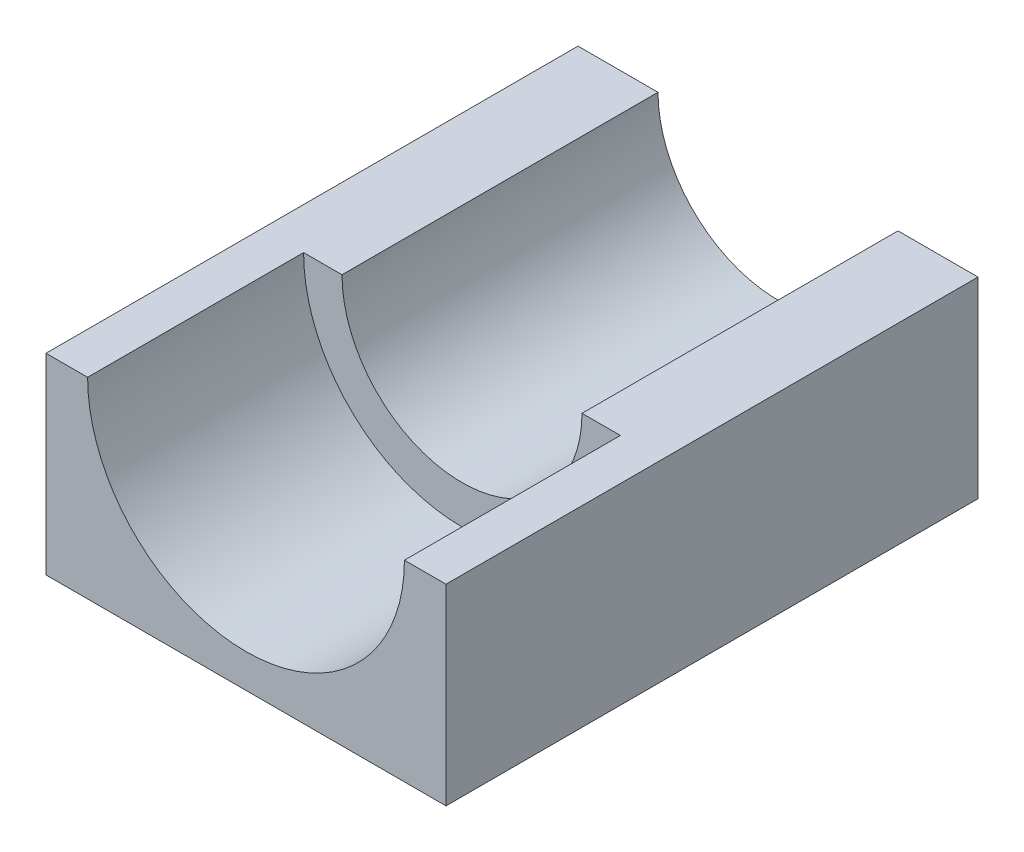
ISO-10303-21;
HEADER;
FILE_DESCRIPTION(('STEP AP214'),'2;1');
FILE_NAME('part.step','',(''),(''),'','','');
FILE_SCHEMA(('AUTOMOTIVE_DESIGN { 1 0 10303 214 1 1 1 1 }'));
ENDSEC;
DATA;
#1=APPLICATION_CONTEXT('core data for automotive mechanical design processes');
#2=APPLICATION_PROTOCOL_DEFINITION('international standard','automotive_design',2000,#1);
#3=PRODUCT_CONTEXT('',#1,'mechanical');
#4=PRODUCT('Part','Part','',(#3));
#5=PRODUCT_RELATED_PRODUCT_CATEGORY('part','',(#4));
#6=PRODUCT_DEFINITION_FORMATION('','',#4);
#7=PRODUCT_DEFINITION_CONTEXT('part definition',#1,'design');
#8=PRODUCT_DEFINITION('design','',#6,#7);
#9=PRODUCT_DEFINITION_SHAPE('','',#8);
#10=(LENGTH_UNIT() NAMED_UNIT(*) SI_UNIT(.MILLI.,.METRE.));
#11=(NAMED_UNIT(*) PLANE_ANGLE_UNIT() SI_UNIT($,.RADIAN.));
#12=(NAMED_UNIT(*) SI_UNIT($,.STERADIAN.) SOLID_ANGLE_UNIT());
#13=UNCERTAINTY_MEASURE_WITH_UNIT(LENGTH_MEASURE(1.E-05),#10,'distance_accuracy_value','');
#14=(GEOMETRIC_REPRESENTATION_CONTEXT(3) GLOBAL_UNCERTAINTY_ASSIGNED_CONTEXT((#13)) GLOBAL_UNIT_ASSIGNED_CONTEXT((#10,
#11,#12)) REPRESENTATION_CONTEXT('',''));
#15=CARTESIAN_POINT('',(0.,0.,0.));
#16=DIRECTION('',(0.,0.,1.));
#17=DIRECTION('',(1.,0.,0.));
#18=AXIS2_PLACEMENT_3D('',#15,#16,#17);
#19=CARTESIAN_POINT('',(-20.5820227256488,8.15048099935691,-66.5));
#20=DIRECTION('',(0.,1.,0.));
#21=DIRECTION('',(0.,0.,1.));
#22=AXIS2_PLACEMENT_3D('',#19,#20,#21);
#23=PLANE('',#22);
#24=DIRECTION('',(0.,0.,1.));
#25=VECTOR('',#24,1.);
#26=CARTESIAN_POINT('',(-10.5820227256488,8.15048099935691,-66.5));
#27=LINE('',#26,#25);
#28=CARTESIAN_POINT('',(-10.5820227256488,8.15048099935691,-66.5));
#29=VERTEX_POINT('',#28);
#30=CARTESIAN_POINT('',(-10.5820227256488,8.15048099935691,-27.));
#31=VERTEX_POINT('',#30);
#32=EDGE_CURVE('E46',#29,#31,#27,.T.);
#33=ORIENTED_EDGE('',*,*,#32,.F.);
#34=DIRECTION('',(-1.,0.,0.));
#35=VECTOR('',#34,1.);
#36=CARTESIAN_POINT('',(-20.5820227256488,8.15048099935691,-66.5));
#37=LINE('',#36,#35);
#38=CARTESIAN_POINT('',(-20.5820227256488,8.15048099935691,-66.5));
#39=VERTEX_POINT('',#38);
#40=EDGE_CURVE('E110',#29,#39,#37,.T.);
#41=ORIENTED_EDGE('',*,*,#40,.T.);
#42=DIRECTION('',(0.,0.,1.));
#43=VECTOR('',#42,1.);
#44=CARTESIAN_POINT('',(-20.5820227256488,8.15048099935691,-66.5));
#45=LINE('',#44,#43);
#46=CARTESIAN_POINT('',(-20.5820227256488,8.15048099935691,0.));
#47=VERTEX_POINT('',#46);
#48=EDGE_CURVE('E142',#39,#47,#45,.T.);
#49=ORIENTED_EDGE('',*,*,#48,.T.);
#50=DIRECTION('',(-1.,0.,0.));
#51=VECTOR('',#50,1.);
#52=CARTESIAN_POINT('',(-20.5820227256488,8.15048099935691,0.));
#53=LINE('',#52,#51);
#54=CARTESIAN_POINT('',(-15.3820227256488,8.15048099935691,0.));
#55=VERTEX_POINT('',#54);
#56=EDGE_CURVE('E129',#55,#47,#53,.T.);
#57=ORIENTED_EDGE('',*,*,#56,.F.);
#58=DIRECTION('',(0.,0.,1.));
#59=VECTOR('',#58,1.);
#60=CARTESIAN_POINT('',(-15.3820227256488,8.15048099935691,-27.));
#61=LINE('',#60,#59);
#62=CARTESIAN_POINT('',(-15.3820227256488,8.15048099935691,-27.));
#63=VERTEX_POINT('',#62);
#64=EDGE_CURVE('E54',#63,#55,#61,.T.);
#65=ORIENTED_EDGE('',*,*,#64,.F.);
#66=DIRECTION('',(1.,0.,0.));
#67=VECTOR('',#66,1.);
#68=CARTESIAN_POINT('',(-20.5820227256488,8.15048099935691,-27.));
#69=LINE('',#68,#67);
#70=EDGE_CURVE('E40',#63,#31,#69,.T.);
#71=ORIENTED_EDGE('',*,*,#70,.T.);
#72=EDGE_LOOP('',(#33,#41,#49,#57,#65,#71));
#73=FACE_BOUND('',#72,.T.);
#74=ADVANCED_FACE('F32',(#73),#23,.T.);
#75=CARTESIAN_POINT('',(29.4179772743512,-11.6495190006431,-66.5));
#76=DIRECTION('',(1.,0.,0.));
#77=DIRECTION('',(0.,1.,0.));
#78=AXIS2_PLACEMENT_3D('',#75,#76,#77);
#79=PLANE('',#78);
#80=DIRECTION('',(0.,1.,0.));
#81=VECTOR('',#80,1.);
#82=CARTESIAN_POINT('',(29.4179772743512,-11.6495190006431,0.));
#83=LINE('',#82,#81);
#84=CARTESIAN_POINT('',(29.4179772743512,-15.8495190006431,0.));
#85=VERTEX_POINT('',#84);
#86=CARTESIAN_POINT('',(29.4179772743512,8.15048099935691,0.));
#87=VERTEX_POINT('',#86);
#88=EDGE_CURVE('E135',#85,#87,#83,.T.);
#89=ORIENTED_EDGE('',*,*,#88,.F.);
#90=DIRECTION('',(0.,0.,1.));
#91=VECTOR('',#90,1.);
#92=CARTESIAN_POINT('',(29.4179772743512,-15.8495190006431,-66.5));
#93=LINE('',#92,#91);
#94=CARTESIAN_POINT('',(29.4179772743512,-15.8495190006431,-66.5));
#95=VERTEX_POINT('',#94);
#96=EDGE_CURVE('E137',#95,#85,#93,.T.);
#97=ORIENTED_EDGE('',*,*,#96,.F.);
#98=DIRECTION('',(0.,1.,0.));
#99=VECTOR('',#98,1.);
#100=CARTESIAN_POINT('',(29.4179772743512,-11.6495190006431,-66.5));
#101=LINE('',#100,#99);
#102=CARTESIAN_POINT('',(29.4179772743512,8.15048099935691,-66.5));
#103=VERTEX_POINT('',#102);
#104=EDGE_CURVE('E119',#95,#103,#101,.T.);
#105=ORIENTED_EDGE('',*,*,#104,.T.);
#106=DIRECTION('',(0.,0.,1.));
#107=VECTOR('',#106,1.);
#108=CARTESIAN_POINT('',(29.4179772743512,8.15048099935691,-66.5));
#109=LINE('',#108,#107);
#110=EDGE_CURVE('E114',#103,#87,#109,.T.);
#111=ORIENTED_EDGE('',*,*,#110,.T.);
#112=EDGE_LOOP('',(#89,#97,#105,#111));
#113=FACE_BOUND('',#112,.T.);
#114=ADVANCED_FACE('F170',(#113),#79,.T.);
#115=CARTESIAN_POINT('',(-20.5820227256488,-15.8495190006431,-66.5));
#116=DIRECTION('',(0.,-1.,0.));
#117=DIRECTION('',(1.,0.,0.));
#118=AXIS2_PLACEMENT_3D('',#115,#116,#117);
#119=PLANE('',#118);
#120=DIRECTION('',(1.,0.,0.));
#121=VECTOR('',#120,1.);
#122=CARTESIAN_POINT('',(-20.5820227256488,-15.8495190006431,0.));
#123=LINE('',#122,#121);
#124=CARTESIAN_POINT('',(-20.5820227256488,-15.8495190006431,0.));
#125=VERTEX_POINT('',#124);
#126=EDGE_CURVE('E132',#125,#85,#123,.T.);
#127=ORIENTED_EDGE('',*,*,#126,.F.);
#128=DIRECTION('',(0.,0.,1.));
#129=VECTOR('',#128,1.);
#130=CARTESIAN_POINT('',(-20.5820227256488,-15.8495190006431,-66.5));
#131=LINE('',#130,#129);
#132=CARTESIAN_POINT('',(-20.5820227256488,-15.8495190006431,-66.5));
#133=VERTEX_POINT('',#132);
#134=EDGE_CURVE('E140',#133,#125,#131,.T.);
#135=ORIENTED_EDGE('',*,*,#134,.F.);
#136=DIRECTION('',(1.,0.,0.));
#137=VECTOR('',#136,1.);
#138=CARTESIAN_POINT('',(-20.5820227256488,-15.8495190006431,-66.5));
#139=LINE('',#138,#137);
#140=EDGE_CURVE('E117',#133,#95,#139,.T.);
#141=ORIENTED_EDGE('',*,*,#140,.T.);
#142=ORIENTED_EDGE('',*,*,#96,.T.);
#143=EDGE_LOOP('',(#127,#135,#141,#142));
#144=FACE_BOUND('',#143,.T.);
#145=ADVANCED_FACE('F174',(#144),#119,.T.);
#146=CARTESIAN_POINT('',(-20.5820227256488,-5.70241059027508,-66.5));
#147=DIRECTION('',(-1.,0.,0.));
#148=DIRECTION('',(0.,0.,1.));
#149=AXIS2_PLACEMENT_3D('',#146,#147,#148);
#150=PLANE('',#149);
#151=DIRECTION('',(0.,-1.,0.));
#152=VECTOR('',#151,1.);
#153=CARTESIAN_POINT('',(-20.5820227256488,-5.70241059027508,0.));
#154=LINE('',#153,#152);
#155=EDGE_CURVE('E128',#47,#125,#154,.T.);
#156=ORIENTED_EDGE('',*,*,#155,.F.);
#157=ORIENTED_EDGE('',*,*,#48,.F.);
#158=DIRECTION('',(0.,-1.,0.));
#159=VECTOR('',#158,1.);
#160=CARTESIAN_POINT('',(-20.5820227256488,-5.70241059027508,-66.5));
#161=LINE('',#160,#159);
#162=EDGE_CURVE('E115',#39,#133,#161,.T.);
#163=ORIENTED_EDGE('',*,*,#162,.T.);
#164=ORIENTED_EDGE('',*,*,#134,.T.);
#165=EDGE_LOOP('',(#156,#157,#163,#164));
#166=FACE_BOUND('',#165,.T.);
#167=ADVANCED_FACE('F166',(#166),#150,.T.);
#168=DIRECTION('',(0.,0.,1.));
#169=VECTOR('',#168,1.);
#170=CARTESIAN_POINT('',(19.4179772743512,8.15048099935691,-66.5));
#171=LINE('',#170,#169);
#172=CARTESIAN_POINT('',(19.4179772743512,8.15048099935691,-27.));
#173=VERTEX_POINT('',#172);
#174=CARTESIAN_POINT('',(19.4179772743512,8.15048099935691,-66.5));
#175=VERTEX_POINT('',#174);
#176=EDGE_CURVE('E95',#173,#175,#171,.F.);
#177=ORIENTED_EDGE('',*,*,#176,.F.);
#178=CARTESIAN_POINT('',(24.2179772743512,8.15048099935691,-27.));
#179=VERTEX_POINT('',#178);
#180=EDGE_CURVE('E146',#173,#179,#69,.T.);
#181=ORIENTED_EDGE('',*,*,#180,.T.);
#182=DIRECTION('',(0.,0.,1.));
#183=VECTOR('',#182,1.);
#184=CARTESIAN_POINT('',(24.2179772743512,8.15048099935691,-27.));
#185=LINE('',#184,#183);
#186=CARTESIAN_POINT('',(24.2179772743512,8.15048099935691,0.));
#187=VERTEX_POINT('',#186);
#188=EDGE_CURVE('E151',#187,#179,#185,.F.);
#189=ORIENTED_EDGE('',*,*,#188,.F.);
#190=EDGE_CURVE('E125',#87,#187,#53,.T.);
#191=ORIENTED_EDGE('',*,*,#190,.F.);
#192=ORIENTED_EDGE('',*,*,#110,.F.);
#193=EDGE_CURVE('E107',#103,#175,#37,.T.);
#194=ORIENTED_EDGE('',*,*,#193,.T.);
#195=EDGE_LOOP('',(#177,#181,#189,#191,#192,#194));
#196=FACE_BOUND('',#195,.T.);
#197=ADVANCED_FACE('F34',(#196),#23,.T.);
#198=CARTESIAN_POINT('',(0.,0.,-66.5));
#199=DIRECTION('',(0.,0.,-1.));
#200=DIRECTION('',(-1.,0.,0.));
#201=AXIS2_PLACEMENT_3D('',#198,#199,#200);
#202=PLANE('',#201);
#203=CARTESIAN_POINT('',(4.41797727435124,8.15048099935691,-66.5));
#204=DIRECTION('',(0.,0.,1.));
#205=DIRECTION('',(1.,0.,0.));
#206=AXIS2_PLACEMENT_3D('',#203,#204,#205);
#207=CIRCLE('',#206,15.);
#208=EDGE_CURVE('E98',#29,#175,#207,.T.);
#209=ORIENTED_EDGE('',*,*,#208,.T.);
#210=ORIENTED_EDGE('',*,*,#193,.F.);
#211=ORIENTED_EDGE('',*,*,#104,.F.);
#212=ORIENTED_EDGE('',*,*,#140,.F.);
#213=ORIENTED_EDGE('',*,*,#162,.F.);
#214=ORIENTED_EDGE('',*,*,#40,.F.);
#215=EDGE_LOOP('',(#209,#210,#211,#212,#213,#214));
#216=FACE_BOUND('',#215,.T.);
#217=ADVANCED_FACE('F106',(#216),#202,.T.);
#218=CARTESIAN_POINT('',(0.,0.,0.));
#219=DIRECTION('',(0.,0.,-1.));
#220=DIRECTION('',(-1.,0.,0.));
#221=AXIS2_PLACEMENT_3D('',#218,#219,#220);
#222=PLANE('',#221);
#223=ORIENTED_EDGE('',*,*,#190,.T.);
#224=CARTESIAN_POINT('',(4.41797727435125,8.15048099935691,0.));
#225=DIRECTION('',(0.,0.,-1.));
#226=DIRECTION('',(-1.,0.,0.));
#227=AXIS2_PLACEMENT_3D('',#224,#225,#226);
#228=CIRCLE('',#227,19.8);
#229=EDGE_CURVE('E139',#187,#55,#228,.T.);
#230=ORIENTED_EDGE('',*,*,#229,.T.);
#231=ORIENTED_EDGE('',*,*,#56,.T.);
#232=ORIENTED_EDGE('',*,*,#155,.T.);
#233=ORIENTED_EDGE('',*,*,#126,.T.);
#234=ORIENTED_EDGE('',*,*,#88,.T.);
#235=EDGE_LOOP('',(#223,#230,#231,#232,#233,#234));
#236=FACE_BOUND('',#235,.T.);
#237=ADVANCED_FACE('F163',(#236),#222,.F.);
#238=CARTESIAN_POINT('',(4.41797727435125,8.15048099935691,-27.));
#239=DIRECTION('',(0.,0.,1.));
#240=DIRECTION('',(1.,0.,0.));
#241=AXIS2_PLACEMENT_3D('',#238,#239,#240);
#242=CYLINDRICAL_SURFACE('',#241,19.8);
#243=ORIENTED_EDGE('',*,*,#64,.T.);
#244=ORIENTED_EDGE('',*,*,#229,.F.);
#245=ORIENTED_EDGE('',*,*,#188,.T.);
#246=CARTESIAN_POINT('',(4.41797727435125,8.15048099935691,-27.));
#247=DIRECTION('',(0.,0.,1.));
#248=DIRECTION('',(1.,0.,0.));
#249=AXIS2_PLACEMENT_3D('',#246,#247,#248);
#250=CIRCLE('',#249,19.8);
#251=EDGE_CURVE('E155',#63,#179,#250,.T.);
#252=ORIENTED_EDGE('',*,*,#251,.F.);
#253=EDGE_LOOP('',(#243,#244,#245,#252));
#254=FACE_BOUND('',#253,.T.);
#255=ADVANCED_FACE('F154',(#254),#242,.F.);
#256=CARTESIAN_POINT('',(4.41797727435125,8.15048099935691,-27.));
#257=DIRECTION('',(0.,0.,1.));
#258=DIRECTION('',(1.,0.,0.));
#259=AXIS2_PLACEMENT_3D('',#256,#257,#258);
#260=PLANE('',#259);
#261=CARTESIAN_POINT('',(4.41797727435124,8.15048099935691,-27.));
#262=DIRECTION('',(0.,0.,1.));
#263=DIRECTION('',(1.,0.,0.));
#264=AXIS2_PLACEMENT_3D('',#261,#262,#263);
#265=CIRCLE('',#264,15.);
#266=EDGE_CURVE('E11',#31,#173,#265,.T.);
#267=ORIENTED_EDGE('',*,*,#266,.F.);
#268=ORIENTED_EDGE('',*,*,#70,.F.);
#269=ORIENTED_EDGE('',*,*,#251,.T.);
#270=ORIENTED_EDGE('',*,*,#180,.F.);
#271=EDGE_LOOP('',(#267,#268,#269,#270));
#272=FACE_BOUND('',#271,.T.);
#273=ADVANCED_FACE('F157',(#272),#260,.T.);
#274=CARTESIAN_POINT('',(4.41797727435124,8.15048099935691,-66.5));
#275=DIRECTION('',(0.,0.,1.));
#276=DIRECTION('',(1.,0.,0.));
#277=AXIS2_PLACEMENT_3D('',#274,#275,#276);
#278=CYLINDRICAL_SURFACE('',#277,15.);
#279=ORIENTED_EDGE('',*,*,#32,.T.);
#280=ORIENTED_EDGE('',*,*,#266,.T.);
#281=ORIENTED_EDGE('',*,*,#176,.T.);
#282=ORIENTED_EDGE('',*,*,#208,.F.);
#283=EDGE_LOOP('',(#279,#280,#281,#282));
#284=FACE_BOUND('',#283,.T.);
#285=ADVANCED_FACE('F97',(#284),#278,.F.);
#286=CLOSED_SHELL('',(#74,#114,#145,#167,#197,#217,#237,#255,#273,#285));
#287=MANIFOLD_SOLID_BREP('B2',#286);
#288=ADVANCED_BREP_SHAPE_REPRESENTATION('',(#18,#287),#14);
#289=SHAPE_DEFINITION_REPRESENTATION(#9,#288);
ENDSEC;
END-ISO-10303-21;
